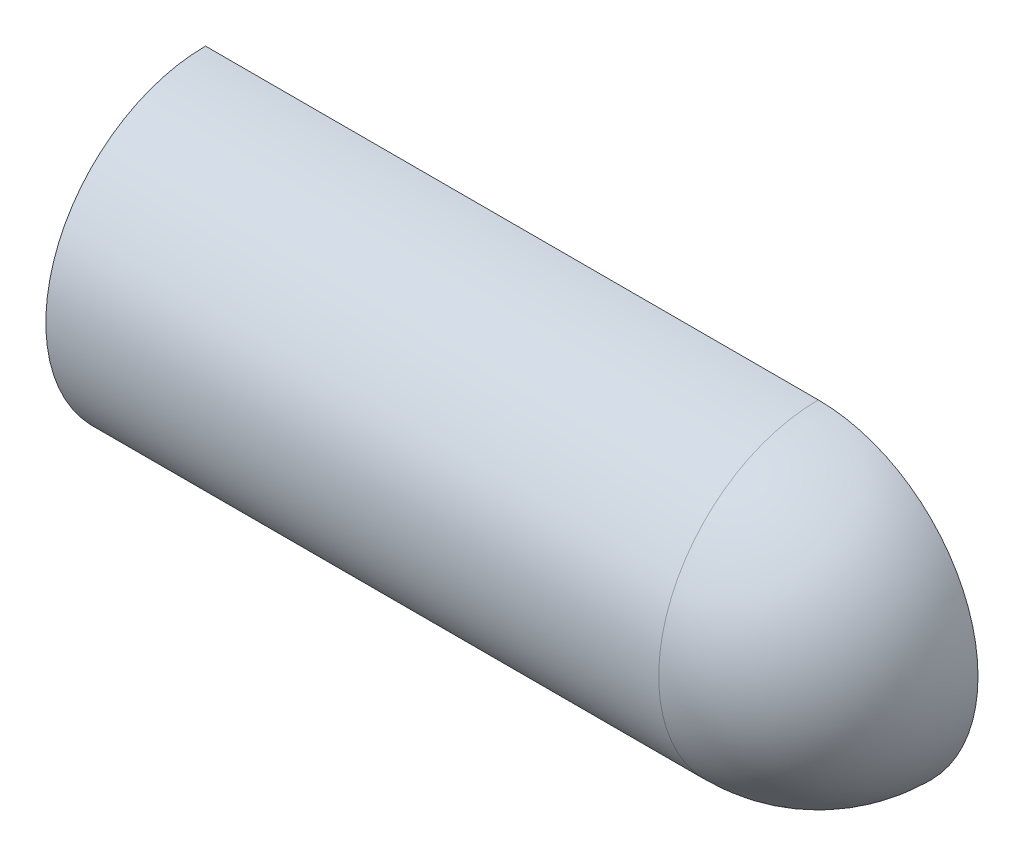
ISO-10303-21;
HEADER;
FILE_DESCRIPTION(('STEP AP214'),'2;1');
FILE_NAME('part.step','',(''),(''),'','','');
FILE_SCHEMA(('AUTOMOTIVE_DESIGN { 1 0 10303 214 1 1 1 1 }'));
ENDSEC;
DATA;
#1=APPLICATION_CONTEXT('core data for automotive mechanical design processes');
#2=APPLICATION_PROTOCOL_DEFINITION('international standard','automotive_design',2000,#1);
#3=PRODUCT_CONTEXT('',#1,'mechanical');
#4=PRODUCT('Part','Part','',(#3));
#5=PRODUCT_RELATED_PRODUCT_CATEGORY('part','',(#4));
#6=PRODUCT_DEFINITION_FORMATION('','',#4);
#7=PRODUCT_DEFINITION_CONTEXT('part definition',#1,'design');
#8=PRODUCT_DEFINITION('design','',#6,#7);
#9=PRODUCT_DEFINITION_SHAPE('','',#8);
#10=(LENGTH_UNIT() NAMED_UNIT(*) SI_UNIT(.MILLI.,.METRE.));
#11=(NAMED_UNIT(*) PLANE_ANGLE_UNIT() SI_UNIT($,.RADIAN.));
#12=(NAMED_UNIT(*) SI_UNIT($,.STERADIAN.) SOLID_ANGLE_UNIT());
#13=UNCERTAINTY_MEASURE_WITH_UNIT(LENGTH_MEASURE(1.E-05),#10,'distance_accuracy_value','');
#14=(GEOMETRIC_REPRESENTATION_CONTEXT(3) GLOBAL_UNCERTAINTY_ASSIGNED_CONTEXT((#13)) GLOBAL_UNIT_ASSIGNED_CONTEXT((#10,
#11,#12)) REPRESENTATION_CONTEXT('',''));
#15=CARTESIAN_POINT('',(0.,0.,0.));
#16=DIRECTION('',(0.,0.,1.));
#17=DIRECTION('',(1.,0.,0.));
#18=AXIS2_PLACEMENT_3D('',#15,#16,#17);
#19=CARTESIAN_POINT('',(1.2490009027033E-13,-6.69603261727048E-13,0.));
#20=DIRECTION('',(-1.,0.,0.));
#21=DIRECTION('',(0.,-1.,0.));
#22=AXIS2_PLACEMENT_3D('',#19,#20,#21);
#23=SPHERICAL_SURFACE('',#22,26.0000000000165);
#24=CARTESIAN_POINT('',(1.21430643318376E-13,0.,0.));
#25=DIRECTION('',(-1.,0.,0.));
#26=DIRECTION('',(0.,0.,1.));
#27=AXIS2_PLACEMENT_3D('',#24,#25,#26);
#28=CIRCLE('',#27,26.0000000000172);
#29=CARTESIAN_POINT('',(1.21716008635588E-13,-26.0000000000172,-1.81557029619963E-13));
#30=VERTEX_POINT('',#29);
#31=CARTESIAN_POINT('',(1.21716008635588E-13,26.0000000000172,0.));
#32=VERTEX_POINT('',#31);
#33=EDGE_CURVE('E54',#30,#32,#28,.T.);
#34=ORIENTED_EDGE('',*,*,#33,.T.);
#35=CARTESIAN_POINT('',(1.2490009027033E-13,-6.69603261727048E-13,0.));
#36=DIRECTION('',(0.,0.,1.));
#37=DIRECTION('',(1.,0.,0.));
#38=AXIS2_PLACEMENT_3D('',#35,#36,#37);
#39=CIRCLE('',#38,26.0000000000165);
#40=EDGE_CURVE('E88',#30,#32,#39,.T.);
#41=ORIENTED_EDGE('',*,*,#40,.F.);
#42=EDGE_LOOP('',(#34,#41));
#43=FACE_BOUND('',#42,.T.);
#44=ADVANCED_FACE('F39',(#43),#23,.F.);
#45=CARTESIAN_POINT('',(1.2490009027033E-13,-6.69603261727048E-13,0.));
#46=DIRECTION('',(-1.,0.,0.));
#47=DIRECTION('',(0.,1.,0.));
#48=AXIS2_PLACEMENT_3D('',#45,#46,#47);
#49=SPHERICAL_SURFACE('',#48,31.000000000007);
#50=CARTESIAN_POINT('',(-1.02522157430229E-11,0.,0.));
#51=DIRECTION('',(-1.,0.,0.));
#52=DIRECTION('',(0.,0.,1.));
#53=AXIS2_PLACEMENT_3D('',#50,#51,#52);
#54=CIRCLE('',#53,31.0000000000076);
#55=CARTESIAN_POINT('',(-1.02533428982287E-11,-31.0000000000076,-2.16471843008328E-13));
#56=VERTEX_POINT('',#55);
#57=CARTESIAN_POINT('',(-1.02533428982287E-11,31.0000000000076,0.));
#58=VERTEX_POINT('',#57);
#59=EDGE_CURVE('E11',#56,#58,#54,.T.);
#60=ORIENTED_EDGE('',*,*,#59,.F.);
#61=CARTESIAN_POINT('',(1.2490009027033E-13,-6.69603261727048E-13,0.));
#62=DIRECTION('',(0.,0.,-1.));
#63=DIRECTION('',(1.,0.,0.));
#64=AXIS2_PLACEMENT_3D('',#61,#62,#63);
#65=CIRCLE('',#64,31.000000000007);
#66=EDGE_CURVE('E82',#58,#56,#65,.T.);
#67=ORIENTED_EDGE('',*,*,#66,.F.);
#68=EDGE_LOOP('',(#60,#67));
#69=FACE_BOUND('',#68,.T.);
#70=ADVANCED_FACE('F41',(#69),#49,.T.);
#71=CARTESIAN_POINT('',(26.0000000000166,0.,0.));
#72=DIRECTION('',(-1.,0.,0.));
#73=DIRECTION('',(0.,0.,1.));
#74=AXIS2_PLACEMENT_3D('',#71,#72,#73);
#75=CYLINDRICAL_SURFACE('',#74,31.0000000000112);
#76=CARTESIAN_POINT('',(-119.,0.,0.));
#77=DIRECTION('',(-1.,0.,0.));
#78=DIRECTION('',(0.,0.,1.));
#79=AXIS2_PLACEMENT_3D('',#76,#77,#78);
#80=CIRCLE('',#79,31.0000000000147);
#81=CARTESIAN_POINT('',(-119.,-31.0000000000147,-2.16471843008377E-13));
#82=VERTEX_POINT('',#81);
#83=CARTESIAN_POINT('',(-119.,31.0000000000147,0.));
#84=VERTEX_POINT('',#83);
#85=EDGE_CURVE('E47',#82,#84,#80,.T.);
#86=ORIENTED_EDGE('',*,*,#85,.F.);
#87=DIRECTION('',(-1.,0.,0.));
#88=VECTOR('',#87,1.);
#89=CARTESIAN_POINT('',(-119.,-31.0000000000147,-2.16471843008377E-13));
#90=LINE('',#89,#88);
#91=EDGE_CURVE('E87',#56,#82,#90,.T.);
#92=ORIENTED_EDGE('',*,*,#91,.F.);
#93=ORIENTED_EDGE('',*,*,#59,.T.);
#94=DIRECTION('',(-1.,0.,0.));
#95=VECTOR('',#94,1.);
#96=CARTESIAN_POINT('',(-119.,31.0000000000147,0.));
#97=LINE('',#96,#95);
#98=EDGE_CURVE('E93',#58,#84,#97,.T.);
#99=ORIENTED_EDGE('',*,*,#98,.T.);
#100=EDGE_LOOP('',(#86,#92,#93,#99));
#101=FACE_BOUND('',#100,.T.);
#102=ADVANCED_FACE('F92',(#101),#75,.T.);
#103=CARTESIAN_POINT('',(-119.,-31.0000000000147,-2.16471843008377E-13));
#104=DIRECTION('',(1.,0.,0.));
#105=DIRECTION('',(0.,0.,-1.));
#106=AXIS2_PLACEMENT_3D('',#103,#104,#105);
#107=PLANE('',#106);
#108=CARTESIAN_POINT('',(-119.,0.,0.));
#109=DIRECTION('',(-1.,0.,0.));
#110=DIRECTION('',(0.,0.,1.));
#111=AXIS2_PLACEMENT_3D('',#108,#109,#110);
#112=CIRCLE('',#111,26.0000000000172);
#113=CARTESIAN_POINT('',(-119.,-26.0000000000172,-1.81557029619963E-13));
#114=VERTEX_POINT('',#113);
#115=CARTESIAN_POINT('',(-119.,26.0000000000172,0.));
#116=VERTEX_POINT('',#115);
#117=EDGE_CURVE('E62',#114,#116,#112,.T.);
#118=ORIENTED_EDGE('',*,*,#117,.F.);
#119=DIRECTION('',(0.,1.,0.));
#120=VECTOR('',#119,1.);
#121=CARTESIAN_POINT('',(-119.,-31.0000000000147,-2.16471843008377E-13));
#122=LINE('',#121,#120);
#123=EDGE_CURVE('E105',#82,#114,#122,.T.);
#124=ORIENTED_EDGE('',*,*,#123,.F.);
#125=ORIENTED_EDGE('',*,*,#85,.T.);
#126=DIRECTION('',(0.,-1.,0.));
#127=VECTOR('',#126,1.);
#128=CARTESIAN_POINT('',(-119.,31.0000000000147,0.));
#129=LINE('',#128,#127);
#130=EDGE_CURVE('E97',#84,#116,#129,.T.);
#131=ORIENTED_EDGE('',*,*,#130,.T.);
#132=EDGE_LOOP('',(#118,#124,#125,#131));
#133=FACE_BOUND('',#132,.T.);
#134=ADVANCED_FACE('F111',(#133),#107,.F.);
#135=CARTESIAN_POINT('',(26.0000000000166,0.,0.));
#136=DIRECTION('',(-1.,0.,0.));
#137=DIRECTION('',(0.,0.,1.));
#138=AXIS2_PLACEMENT_3D('',#135,#136,#137);
#139=CYLINDRICAL_SURFACE('',#138,26.0000000000172);
#140=DIRECTION('',(1.,0.,0.));
#141=VECTOR('',#140,1.);
#142=CARTESIAN_POINT('',(1.21716008635588E-13,-26.0000000000172,-1.81557029619963E-13));
#143=LINE('',#142,#141);
#144=EDGE_CURVE('E107',#114,#30,#143,.T.);
#145=ORIENTED_EDGE('',*,*,#144,.F.);
#146=ORIENTED_EDGE('',*,*,#117,.T.);
#147=DIRECTION('',(1.,0.,0.));
#148=VECTOR('',#147,1.);
#149=CARTESIAN_POINT('',(1.21716008635588E-13,26.0000000000172,0.));
#150=LINE('',#149,#148);
#151=EDGE_CURVE('E99',#116,#32,#150,.T.);
#152=ORIENTED_EDGE('',*,*,#151,.T.);
#153=ORIENTED_EDGE('',*,*,#33,.F.);
#154=EDGE_LOOP('',(#145,#146,#152,#153));
#155=FACE_BOUND('',#154,.T.);
#156=ADVANCED_FACE('F112',(#155),#139,.F.);
#157=CARTESIAN_POINT('',(1.2490009027033E-13,-6.69603261727048E-13,0.));
#158=DIRECTION('',(0.,0.,-1.));
#159=DIRECTION('',(1.,0.,0.));
#160=AXIS2_PLACEMENT_3D('',#157,#158,#159);
#161=PLANE('',#160);
#162=ORIENTED_EDGE('',*,*,#40,.T.);
#163=ORIENTED_EDGE('',*,*,#151,.F.);
#164=ORIENTED_EDGE('',*,*,#130,.F.);
#165=ORIENTED_EDGE('',*,*,#98,.F.);
#166=ORIENTED_EDGE('',*,*,#66,.T.);
#167=ORIENTED_EDGE('',*,*,#91,.T.);
#168=ORIENTED_EDGE('',*,*,#123,.T.);
#169=ORIENTED_EDGE('',*,*,#144,.T.);
#170=EDGE_LOOP('',(#162,#163,#164,#165,#166,#167,#168,#169));
#171=FACE_BOUND('',#170,.T.);
#172=ADVANCED_FACE('F95',(#171),#161,.T.);
#173=CLOSED_SHELL('',(#44,#70,#102,#134,#156,#172));
#174=MANIFOLD_SOLID_BREP('B2',#173);
#175=ADVANCED_BREP_SHAPE_REPRESENTATION('',(#18,#174),#14);
#176=SHAPE_DEFINITION_REPRESENTATION(#9,#175);
ENDSEC;
END-ISO-10303-21;
